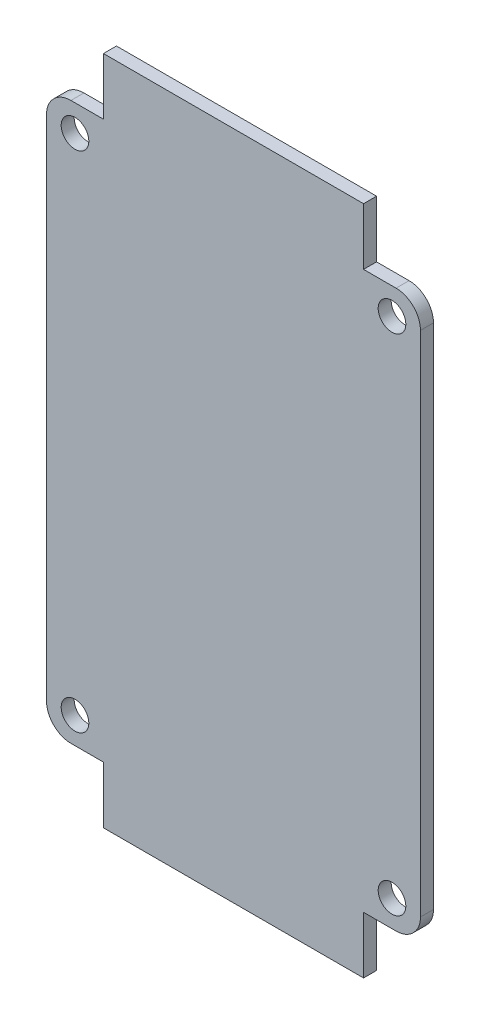
ISO-10303-21;
HEADER;
FILE_DESCRIPTION(('STEP AP214'),'2;1');
FILE_NAME('part.step','',(''),(''),'','','');
FILE_SCHEMA(('AUTOMOTIVE_DESIGN { 1 0 10303 214 1 1 1 1 }'));
ENDSEC;
DATA;
#1=APPLICATION_CONTEXT('core data for automotive mechanical design processes');
#2=APPLICATION_PROTOCOL_DEFINITION('international standard','automotive_design',2000,#1);
#3=PRODUCT_CONTEXT('',#1,'mechanical');
#4=PRODUCT('Part','Part','',(#3));
#5=PRODUCT_RELATED_PRODUCT_CATEGORY('part','',(#4));
#6=PRODUCT_DEFINITION_FORMATION('','',#4);
#7=PRODUCT_DEFINITION_CONTEXT('part definition',#1,'design');
#8=PRODUCT_DEFINITION('design','',#6,#7);
#9=PRODUCT_DEFINITION_SHAPE('','',#8);
#10=(LENGTH_UNIT() NAMED_UNIT(*) SI_UNIT(.MILLI.,.METRE.));
#11=(NAMED_UNIT(*) PLANE_ANGLE_UNIT() SI_UNIT($,.RADIAN.));
#12=(NAMED_UNIT(*) SI_UNIT($,.STERADIAN.) SOLID_ANGLE_UNIT());
#13=UNCERTAINTY_MEASURE_WITH_UNIT(LENGTH_MEASURE(1.E-05),#10,'distance_accuracy_value','');
#14=(GEOMETRIC_REPRESENTATION_CONTEXT(3) GLOBAL_UNCERTAINTY_ASSIGNED_CONTEXT((#13)) GLOBAL_UNIT_ASSIGNED_CONTEXT((#10,
#11,#12)) REPRESENTATION_CONTEXT('',''));
#15=CARTESIAN_POINT('',(0.,0.,0.));
#16=DIRECTION('',(0.,0.,1.));
#17=DIRECTION('',(1.,0.,0.));
#18=AXIS2_PLACEMENT_3D('',#15,#16,#17);
#19=CARTESIAN_POINT('',(-20.,34.25,1.6));
#20=DIRECTION('',(0.,-1.,0.));
#21=DIRECTION('',(1.,0.,0.));
#22=AXIS2_PLACEMENT_3D('',#19,#20,#21);
#23=PLANE('',#22);
#24=DIRECTION('',(-1.,0.,0.));
#25=VECTOR('',#24,1.);
#26=CARTESIAN_POINT('',(-20.,34.25,0.));
#27=LINE('',#26,#25);
#28=CARTESIAN_POINT('',(-16.,34.25,0.));
#29=VERTEX_POINT('',#28);
#30=CARTESIAN_POINT('',(-20.,34.25,0.));
#31=VERTEX_POINT('',#30);
#32=EDGE_CURVE('E180',#29,#31,#27,.T.);
#33=ORIENTED_EDGE('',*,*,#32,.T.);
#34=DIRECTION('',(0.,0.,-1.));
#35=VECTOR('',#34,1.);
#36=CARTESIAN_POINT('',(-20.,34.25,1.6));
#37=LINE('',#36,#35);
#38=CARTESIAN_POINT('',(-20.,34.25,1.6));
#39=VERTEX_POINT('',#38);
#40=EDGE_CURVE('E11',#39,#31,#37,.T.);
#41=ORIENTED_EDGE('',*,*,#40,.F.);
#42=DIRECTION('',(-1.,0.,0.));
#43=VECTOR('',#42,1.);
#44=CARTESIAN_POINT('',(-20.,34.25,1.6));
#45=LINE('',#44,#43);
#46=CARTESIAN_POINT('',(-16.,34.25,1.6));
#47=VERTEX_POINT('',#46);
#48=EDGE_CURVE('E211',#47,#39,#45,.T.);
#49=ORIENTED_EDGE('',*,*,#48,.F.);
#50=DIRECTION('',(0.,0.,-1.));
#51=VECTOR('',#50,1.);
#52=CARTESIAN_POINT('',(-16.,34.25,1.6));
#53=LINE('',#52,#51);
#54=EDGE_CURVE('E176',#47,#29,#53,.T.);
#55=ORIENTED_EDGE('',*,*,#54,.T.);
#56=EDGE_LOOP('',(#33,#41,#49,#55));
#57=FACE_BOUND('',#56,.T.);
#58=ADVANCED_FACE('F34',(#57),#23,.F.);
#59=CARTESIAN_POINT('',(-20.,31.25,1.6));
#60=DIRECTION('',(0.,0.,-1.));
#61=DIRECTION('',(-1.,0.,0.));
#62=AXIS2_PLACEMENT_3D('',#59,#60,#61);
#63=CYLINDRICAL_SURFACE('',#62,3.);
#64=CARTESIAN_POINT('',(-20.,31.25,0.));
#65=DIRECTION('',(0.,0.,1.));
#66=DIRECTION('',(-1.,0.,0.));
#67=AXIS2_PLACEMENT_3D('',#64,#65,#66);
#68=CIRCLE('',#67,3.);
#69=CARTESIAN_POINT('',(-23.,31.25,0.));
#70=VERTEX_POINT('',#69);
#71=EDGE_CURVE('E183',#31,#70,#68,.T.);
#72=ORIENTED_EDGE('',*,*,#71,.T.);
#73=DIRECTION('',(0.,0.,-1.));
#74=VECTOR('',#73,1.);
#75=CARTESIAN_POINT('',(-23.,31.25,1.6));
#76=LINE('',#75,#74);
#77=CARTESIAN_POINT('',(-23.,31.25,1.6));
#78=VERTEX_POINT('',#77);
#79=EDGE_CURVE('E43',#78,#70,#76,.T.);
#80=ORIENTED_EDGE('',*,*,#79,.F.);
#81=CARTESIAN_POINT('',(-20.,31.25,1.6));
#82=DIRECTION('',(0.,0.,1.));
#83=DIRECTION('',(-1.,0.,0.));
#84=AXIS2_PLACEMENT_3D('',#81,#82,#83);
#85=CIRCLE('',#84,3.);
#86=EDGE_CURVE('E119',#39,#78,#85,.T.);
#87=ORIENTED_EDGE('',*,*,#86,.F.);
#88=ORIENTED_EDGE('',*,*,#40,.T.);
#89=EDGE_LOOP('',(#72,#80,#87,#88));
#90=FACE_BOUND('',#89,.T.);
#91=ADVANCED_FACE('F320',(#90),#63,.T.);
#92=CARTESIAN_POINT('',(-23.,-31.25,1.6));
#93=DIRECTION('',(1.,0.,0.));
#94=DIRECTION('',(0.,0.,-1.));
#95=AXIS2_PLACEMENT_3D('',#92,#93,#94);
#96=PLANE('',#95);
#97=DIRECTION('',(0.,-1.,0.));
#98=VECTOR('',#97,1.);
#99=CARTESIAN_POINT('',(-23.,-31.25,0.));
#100=LINE('',#99,#98);
#101=CARTESIAN_POINT('',(-23.,-31.25,0.));
#102=VERTEX_POINT('',#101);
#103=EDGE_CURVE('E186',#70,#102,#100,.T.);
#104=ORIENTED_EDGE('',*,*,#103,.T.);
#105=DIRECTION('',(0.,0.,-1.));
#106=VECTOR('',#105,1.);
#107=CARTESIAN_POINT('',(-23.,-31.25,1.6));
#108=LINE('',#107,#106);
#109=CARTESIAN_POINT('',(-23.,-31.25,1.6));
#110=VERTEX_POINT('',#109);
#111=EDGE_CURVE('E242',#110,#102,#108,.T.);
#112=ORIENTED_EDGE('',*,*,#111,.F.);
#113=DIRECTION('',(0.,-1.,0.));
#114=VECTOR('',#113,1.);
#115=CARTESIAN_POINT('',(-23.,-31.25,1.6));
#116=LINE('',#115,#114);
#117=EDGE_CURVE('E272',#78,#110,#116,.T.);
#118=ORIENTED_EDGE('',*,*,#117,.F.);
#119=ORIENTED_EDGE('',*,*,#79,.T.);
#120=EDGE_LOOP('',(#104,#112,#118,#119));
#121=FACE_BOUND('',#120,.T.);
#122=ADVANCED_FACE('F324',(#121),#96,.F.);
#123=CARTESIAN_POINT('',(-20.,-31.25,1.6));
#124=DIRECTION('',(0.,0.,-1.));
#125=DIRECTION('',(-1.,0.,0.));
#126=AXIS2_PLACEMENT_3D('',#123,#124,#125);
#127=CYLINDRICAL_SURFACE('',#126,3.);
#128=CARTESIAN_POINT('',(-20.,-31.25,0.));
#129=DIRECTION('',(0.,0.,1.));
#130=DIRECTION('',(-1.,0.,0.));
#131=AXIS2_PLACEMENT_3D('',#128,#129,#130);
#132=CIRCLE('',#131,3.);
#133=CARTESIAN_POINT('',(-20.,-34.25,0.));
#134=VERTEX_POINT('',#133);
#135=EDGE_CURVE('E188',#102,#134,#132,.T.);
#136=ORIENTED_EDGE('',*,*,#135,.T.);
#137=DIRECTION('',(0.,0.,-1.));
#138=VECTOR('',#137,1.);
#139=CARTESIAN_POINT('',(-20.,-34.25,1.6));
#140=LINE('',#139,#138);
#141=CARTESIAN_POINT('',(-20.,-34.25,1.6));
#142=VERTEX_POINT('',#141);
#143=EDGE_CURVE('E239',#142,#134,#140,.T.);
#144=ORIENTED_EDGE('',*,*,#143,.F.);
#145=CARTESIAN_POINT('',(-20.,-31.25,1.6));
#146=DIRECTION('',(0.,0.,1.));
#147=DIRECTION('',(-1.,0.,0.));
#148=AXIS2_PLACEMENT_3D('',#145,#146,#147);
#149=CIRCLE('',#148,3.);
#150=EDGE_CURVE('E274',#110,#142,#149,.T.);
#151=ORIENTED_EDGE('',*,*,#150,.F.);
#152=ORIENTED_EDGE('',*,*,#111,.T.);
#153=EDGE_LOOP('',(#136,#144,#151,#152));
#154=FACE_BOUND('',#153,.T.);
#155=ADVANCED_FACE('F328',(#154),#127,.T.);
#156=CARTESIAN_POINT('',(-20.,-34.25,1.6));
#157=DIRECTION('',(0.,1.,0.));
#158=DIRECTION('',(0.,0.,1.));
#159=AXIS2_PLACEMENT_3D('',#156,#157,#158);
#160=PLANE('',#159);
#161=DIRECTION('',(1.,0.,0.));
#162=VECTOR('',#161,1.);
#163=CARTESIAN_POINT('',(-20.,-34.25,0.));
#164=LINE('',#163,#162);
#165=CARTESIAN_POINT('',(-16.,-34.25,0.));
#166=VERTEX_POINT('',#165);
#167=EDGE_CURVE('E190',#134,#166,#164,.T.);
#168=ORIENTED_EDGE('',*,*,#167,.T.);
#169=DIRECTION('',(0.,0.,-1.));
#170=VECTOR('',#169,1.);
#171=CARTESIAN_POINT('',(-16.,-34.25,1.6));
#172=LINE('',#171,#170);
#173=CARTESIAN_POINT('',(-16.,-34.25,1.6));
#174=VERTEX_POINT('',#173);
#175=EDGE_CURVE('E236',#174,#166,#172,.T.);
#176=ORIENTED_EDGE('',*,*,#175,.F.);
#177=DIRECTION('',(1.,0.,0.));
#178=VECTOR('',#177,1.);
#179=CARTESIAN_POINT('',(-20.,-34.25,1.6));
#180=LINE('',#179,#178);
#181=EDGE_CURVE('E276',#142,#174,#180,.T.);
#182=ORIENTED_EDGE('',*,*,#181,.F.);
#183=ORIENTED_EDGE('',*,*,#143,.T.);
#184=EDGE_LOOP('',(#168,#176,#182,#183));
#185=FACE_BOUND('',#184,.T.);
#186=ADVANCED_FACE('F334',(#185),#160,.F.);
#187=CARTESIAN_POINT('',(-16.,-34.25,1.6));
#188=DIRECTION('',(1.,0.,0.));
#189=DIRECTION('',(0.,0.,-1.));
#190=AXIS2_PLACEMENT_3D('',#187,#188,#189);
#191=PLANE('',#190);
#192=DIRECTION('',(0.,-1.,0.));
#193=VECTOR('',#192,1.);
#194=CARTESIAN_POINT('',(-16.,-34.25,0.));
#195=LINE('',#194,#193);
#196=CARTESIAN_POINT('',(-16.,-41.25,0.));
#197=VERTEX_POINT('',#196);
#198=EDGE_CURVE('E192',#166,#197,#195,.T.);
#199=ORIENTED_EDGE('',*,*,#198,.T.);
#200=DIRECTION('',(0.,0.,-1.));
#201=VECTOR('',#200,1.);
#202=CARTESIAN_POINT('',(-16.,-41.25,1.6));
#203=LINE('',#202,#201);
#204=CARTESIAN_POINT('',(-16.,-41.25,1.6));
#205=VERTEX_POINT('',#204);
#206=EDGE_CURVE('E233',#205,#197,#203,.T.);
#207=ORIENTED_EDGE('',*,*,#206,.F.);
#208=DIRECTION('',(0.,-1.,0.));
#209=VECTOR('',#208,1.);
#210=CARTESIAN_POINT('',(-16.,-34.25,1.6));
#211=LINE('',#210,#209);
#212=EDGE_CURVE('E278',#174,#205,#211,.T.);
#213=ORIENTED_EDGE('',*,*,#212,.F.);
#214=ORIENTED_EDGE('',*,*,#175,.T.);
#215=EDGE_LOOP('',(#199,#207,#213,#214));
#216=FACE_BOUND('',#215,.T.);
#217=ADVANCED_FACE('F338',(#216),#191,.F.);
#218=CARTESIAN_POINT('',(-16.,-41.25,1.6));
#219=DIRECTION('',(0.,1.,0.));
#220=DIRECTION('',(0.,0.,1.));
#221=AXIS2_PLACEMENT_3D('',#218,#219,#220);
#222=PLANE('',#221);
#223=DIRECTION('',(1.,0.,0.));
#224=VECTOR('',#223,1.);
#225=CARTESIAN_POINT('',(-16.,-41.25,0.));
#226=LINE('',#225,#224);
#227=CARTESIAN_POINT('',(16.,-41.25,0.));
#228=VERTEX_POINT('',#227);
#229=EDGE_CURVE('E194',#197,#228,#226,.T.);
#230=ORIENTED_EDGE('',*,*,#229,.T.);
#231=DIRECTION('',(0.,0.,-1.));
#232=VECTOR('',#231,1.);
#233=CARTESIAN_POINT('',(16.,-41.25,1.6));
#234=LINE('',#233,#232);
#235=CARTESIAN_POINT('',(16.,-41.25,1.6));
#236=VERTEX_POINT('',#235);
#237=EDGE_CURVE('E230',#236,#228,#234,.T.);
#238=ORIENTED_EDGE('',*,*,#237,.F.);
#239=DIRECTION('',(1.,0.,0.));
#240=VECTOR('',#239,1.);
#241=CARTESIAN_POINT('',(-16.,-41.25,1.6));
#242=LINE('',#241,#240);
#243=EDGE_CURVE('E280',#205,#236,#242,.T.);
#244=ORIENTED_EDGE('',*,*,#243,.F.);
#245=ORIENTED_EDGE('',*,*,#206,.T.);
#246=EDGE_LOOP('',(#230,#238,#244,#245));
#247=FACE_BOUND('',#246,.T.);
#248=ADVANCED_FACE('F342',(#247),#222,.F.);
#249=CARTESIAN_POINT('',(16.,-41.25,1.6));
#250=DIRECTION('',(-1.,0.,0.));
#251=DIRECTION('',(0.,0.,1.));
#252=AXIS2_PLACEMENT_3D('',#249,#250,#251);
#253=PLANE('',#252);
#254=DIRECTION('',(0.,1.,0.));
#255=VECTOR('',#254,1.);
#256=CARTESIAN_POINT('',(16.,-41.25,0.));
#257=LINE('',#256,#255);
#258=CARTESIAN_POINT('',(16.,-34.25,0.));
#259=VERTEX_POINT('',#258);
#260=EDGE_CURVE('E196',#228,#259,#257,.T.);
#261=ORIENTED_EDGE('',*,*,#260,.T.);
#262=DIRECTION('',(0.,0.,-1.));
#263=VECTOR('',#262,1.);
#264=CARTESIAN_POINT('',(16.,-34.25,1.6));
#265=LINE('',#264,#263);
#266=CARTESIAN_POINT('',(16.,-34.25,1.6));
#267=VERTEX_POINT('',#266);
#268=EDGE_CURVE('E227',#267,#259,#265,.T.);
#269=ORIENTED_EDGE('',*,*,#268,.F.);
#270=DIRECTION('',(0.,1.,0.));
#271=VECTOR('',#270,1.);
#272=CARTESIAN_POINT('',(16.,-41.25,1.6));
#273=LINE('',#272,#271);
#274=EDGE_CURVE('E282',#236,#267,#273,.T.);
#275=ORIENTED_EDGE('',*,*,#274,.F.);
#276=ORIENTED_EDGE('',*,*,#237,.T.);
#277=EDGE_LOOP('',(#261,#269,#275,#276));
#278=FACE_BOUND('',#277,.T.);
#279=ADVANCED_FACE('F346',(#278),#253,.F.);
#280=CARTESIAN_POINT('',(16.,-34.25,1.6));
#281=DIRECTION('',(0.,1.,0.));
#282=DIRECTION('',(0.,0.,1.));
#283=AXIS2_PLACEMENT_3D('',#280,#281,#282);
#284=PLANE('',#283);
#285=DIRECTION('',(1.,0.,0.));
#286=VECTOR('',#285,1.);
#287=CARTESIAN_POINT('',(16.,-34.25,0.));
#288=LINE('',#287,#286);
#289=CARTESIAN_POINT('',(20.,-34.25,0.));
#290=VERTEX_POINT('',#289);
#291=EDGE_CURVE('E198',#259,#290,#288,.T.);
#292=ORIENTED_EDGE('',*,*,#291,.T.);
#293=DIRECTION('',(0.,0.,-1.));
#294=VECTOR('',#293,1.);
#295=CARTESIAN_POINT('',(20.,-34.25,1.6));
#296=LINE('',#295,#294);
#297=CARTESIAN_POINT('',(20.,-34.25,1.6));
#298=VERTEX_POINT('',#297);
#299=EDGE_CURVE('E224',#298,#290,#296,.T.);
#300=ORIENTED_EDGE('',*,*,#299,.F.);
#301=DIRECTION('',(1.,0.,0.));
#302=VECTOR('',#301,1.);
#303=CARTESIAN_POINT('',(16.,-34.25,1.6));
#304=LINE('',#303,#302);
#305=EDGE_CURVE('E284',#267,#298,#304,.T.);
#306=ORIENTED_EDGE('',*,*,#305,.F.);
#307=ORIENTED_EDGE('',*,*,#268,.T.);
#308=EDGE_LOOP('',(#292,#300,#306,#307));
#309=FACE_BOUND('',#308,.T.);
#310=ADVANCED_FACE('F350',(#309),#284,.F.);
#311=CARTESIAN_POINT('',(20.,-31.25,1.6));
#312=DIRECTION('',(0.,0.,-1.));
#313=DIRECTION('',(-1.,0.,0.));
#314=AXIS2_PLACEMENT_3D('',#311,#312,#313);
#315=CYLINDRICAL_SURFACE('',#314,3.);
#316=CARTESIAN_POINT('',(20.,-31.25,0.));
#317=DIRECTION('',(0.,0.,1.));
#318=DIRECTION('',(1.,0.,0.));
#319=AXIS2_PLACEMENT_3D('',#316,#317,#318);
#320=CIRCLE('',#319,3.);
#321=CARTESIAN_POINT('',(23.,-31.25,0.));
#322=VERTEX_POINT('',#321);
#323=EDGE_CURVE('E200',#290,#322,#320,.T.);
#324=ORIENTED_EDGE('',*,*,#323,.T.);
#325=DIRECTION('',(0.,0.,-1.));
#326=VECTOR('',#325,1.);
#327=CARTESIAN_POINT('',(23.,-31.25,1.6));
#328=LINE('',#327,#326);
#329=CARTESIAN_POINT('',(23.,-31.25,1.6));
#330=VERTEX_POINT('',#329);
#331=EDGE_CURVE('E221',#330,#322,#328,.T.);
#332=ORIENTED_EDGE('',*,*,#331,.F.);
#333=CARTESIAN_POINT('',(20.,-31.25,1.6));
#334=DIRECTION('',(0.,0.,1.));
#335=DIRECTION('',(1.,0.,0.));
#336=AXIS2_PLACEMENT_3D('',#333,#334,#335);
#337=CIRCLE('',#336,3.);
#338=EDGE_CURVE('E286',#298,#330,#337,.T.);
#339=ORIENTED_EDGE('',*,*,#338,.F.);
#340=ORIENTED_EDGE('',*,*,#299,.T.);
#341=EDGE_LOOP('',(#324,#332,#339,#340));
#342=FACE_BOUND('',#341,.T.);
#343=ADVANCED_FACE('F354',(#342),#315,.T.);
#344=CARTESIAN_POINT('',(23.,-31.25,1.6));
#345=DIRECTION('',(-1.,0.,0.));
#346=DIRECTION('',(0.,0.,1.));
#347=AXIS2_PLACEMENT_3D('',#344,#345,#346);
#348=PLANE('',#347);
#349=DIRECTION('',(0.,1.,0.));
#350=VECTOR('',#349,1.);
#351=CARTESIAN_POINT('',(23.,-31.25,0.));
#352=LINE('',#351,#350);
#353=CARTESIAN_POINT('',(23.,31.25,0.));
#354=VERTEX_POINT('',#353);
#355=EDGE_CURVE('E202',#322,#354,#352,.T.);
#356=ORIENTED_EDGE('',*,*,#355,.T.);
#357=DIRECTION('',(0.,0.,-1.));
#358=VECTOR('',#357,1.);
#359=CARTESIAN_POINT('',(23.,31.25,1.6));
#360=LINE('',#359,#358);
#361=CARTESIAN_POINT('',(23.,31.25,1.6));
#362=VERTEX_POINT('',#361);
#363=EDGE_CURVE('E218',#362,#354,#360,.T.);
#364=ORIENTED_EDGE('',*,*,#363,.F.);
#365=DIRECTION('',(0.,1.,0.));
#366=VECTOR('',#365,1.);
#367=CARTESIAN_POINT('',(23.,-31.25,1.6));
#368=LINE('',#367,#366);
#369=EDGE_CURVE('E288',#330,#362,#368,.T.);
#370=ORIENTED_EDGE('',*,*,#369,.F.);
#371=ORIENTED_EDGE('',*,*,#331,.T.);
#372=EDGE_LOOP('',(#356,#364,#370,#371));
#373=FACE_BOUND('',#372,.T.);
#374=ADVANCED_FACE('F358',(#373),#348,.F.);
#375=CARTESIAN_POINT('',(20.,31.25,1.6));
#376=DIRECTION('',(0.,0.,-1.));
#377=DIRECTION('',(-1.,0.,0.));
#378=AXIS2_PLACEMENT_3D('',#375,#376,#377);
#379=CYLINDRICAL_SURFACE('',#378,3.00000000000001);
#380=CARTESIAN_POINT('',(20.,31.25,0.));
#381=DIRECTION('',(0.,0.,1.));
#382=DIRECTION('',(-1.,0.,0.));
#383=AXIS2_PLACEMENT_3D('',#380,#381,#382);
#384=CIRCLE('',#383,3.00000000000001);
#385=CARTESIAN_POINT('',(20.,34.25,0.));
#386=VERTEX_POINT('',#385);
#387=EDGE_CURVE('E204',#354,#386,#384,.T.);
#388=ORIENTED_EDGE('',*,*,#387,.T.);
#389=DIRECTION('',(0.,0.,-1.));
#390=VECTOR('',#389,1.);
#391=CARTESIAN_POINT('',(20.,34.25,1.6));
#392=LINE('',#391,#390);
#393=CARTESIAN_POINT('',(20.,34.25,1.6));
#394=VERTEX_POINT('',#393);
#395=EDGE_CURVE('E215',#394,#386,#392,.T.);
#396=ORIENTED_EDGE('',*,*,#395,.F.);
#397=CARTESIAN_POINT('',(20.,31.25,1.6));
#398=DIRECTION('',(0.,0.,1.));
#399=DIRECTION('',(-1.,0.,0.));
#400=AXIS2_PLACEMENT_3D('',#397,#398,#399);
#401=CIRCLE('',#400,3.00000000000001);
#402=EDGE_CURVE('E290',#362,#394,#401,.T.);
#403=ORIENTED_EDGE('',*,*,#402,.F.);
#404=ORIENTED_EDGE('',*,*,#363,.T.);
#405=EDGE_LOOP('',(#388,#396,#403,#404));
#406=FACE_BOUND('',#405,.T.);
#407=ADVANCED_FACE('F296',(#406),#379,.T.);
#408=CARTESIAN_POINT('',(16.,34.25,1.6));
#409=DIRECTION('',(0.,-1.,0.));
#410=DIRECTION('',(1.,0.,0.));
#411=AXIS2_PLACEMENT_3D('',#408,#409,#410);
#412=PLANE('',#411);
#413=DIRECTION('',(-1.,0.,0.));
#414=VECTOR('',#413,1.);
#415=CARTESIAN_POINT('',(16.,34.25,0.));
#416=LINE('',#415,#414);
#417=CARTESIAN_POINT('',(16.,34.25,0.));
#418=VERTEX_POINT('',#417);
#419=EDGE_CURVE('E206',#386,#418,#416,.T.);
#420=ORIENTED_EDGE('',*,*,#419,.T.);
#421=DIRECTION('',(0.,0.,-1.));
#422=VECTOR('',#421,1.);
#423=CARTESIAN_POINT('',(16.,34.25,1.6));
#424=LINE('',#423,#422);
#425=CARTESIAN_POINT('',(16.,34.25,1.6));
#426=VERTEX_POINT('',#425);
#427=EDGE_CURVE('E171',#426,#418,#424,.T.);
#428=ORIENTED_EDGE('',*,*,#427,.F.);
#429=DIRECTION('',(-1.,0.,0.));
#430=VECTOR('',#429,1.);
#431=CARTESIAN_POINT('',(16.,34.25,1.6));
#432=LINE('',#431,#430);
#433=EDGE_CURVE('E162',#394,#426,#432,.T.);
#434=ORIENTED_EDGE('',*,*,#433,.F.);
#435=ORIENTED_EDGE('',*,*,#395,.T.);
#436=EDGE_LOOP('',(#420,#428,#434,#435));
#437=FACE_BOUND('',#436,.T.);
#438=ADVANCED_FACE('F300',(#437),#412,.F.);
#439=CARTESIAN_POINT('',(16.,41.25,1.6));
#440=DIRECTION('',(-1.,0.,0.));
#441=DIRECTION('',(0.,-1.,0.));
#442=AXIS2_PLACEMENT_3D('',#439,#440,#441);
#443=PLANE('',#442);
#444=DIRECTION('',(0.,1.,0.));
#445=VECTOR('',#444,1.);
#446=CARTESIAN_POINT('',(16.,41.25,0.));
#447=LINE('',#446,#445);
#448=CARTESIAN_POINT('',(16.,41.25,0.));
#449=VERTEX_POINT('',#448);
#450=EDGE_CURVE('E170',#418,#449,#447,.T.);
#451=ORIENTED_EDGE('',*,*,#450,.T.);
#452=DIRECTION('',(0.,0.,-1.));
#453=VECTOR('',#452,1.);
#454=CARTESIAN_POINT('',(16.,41.25,1.6));
#455=LINE('',#454,#453);
#456=CARTESIAN_POINT('',(16.,41.25,1.6));
#457=VERTEX_POINT('',#456);
#458=EDGE_CURVE('E167',#457,#449,#455,.T.);
#459=ORIENTED_EDGE('',*,*,#458,.F.);
#460=DIRECTION('',(0.,1.,0.));
#461=VECTOR('',#460,1.);
#462=CARTESIAN_POINT('',(16.,41.25,1.6));
#463=LINE('',#462,#461);
#464=EDGE_CURVE('E156',#426,#457,#463,.T.);
#465=ORIENTED_EDGE('',*,*,#464,.F.);
#466=ORIENTED_EDGE('',*,*,#427,.T.);
#467=EDGE_LOOP('',(#451,#459,#465,#466));
#468=FACE_BOUND('',#467,.T.);
#469=ADVANCED_FACE('F168',(#468),#443,.F.);
#470=CARTESIAN_POINT('',(-16.,41.25,1.6));
#471=DIRECTION('',(0.,-1.,0.));
#472=DIRECTION('',(0.,0.,-1.));
#473=AXIS2_PLACEMENT_3D('',#470,#471,#472);
#474=PLANE('',#473);
#475=DIRECTION('',(-1.,0.,0.));
#476=VECTOR('',#475,1.);
#477=CARTESIAN_POINT('',(-16.,41.25,0.));
#478=LINE('',#477,#476);
#479=CARTESIAN_POINT('',(-16.,41.25,0.));
#480=VERTEX_POINT('',#479);
#481=EDGE_CURVE('E105',#449,#480,#478,.T.);
#482=ORIENTED_EDGE('',*,*,#481,.T.);
#483=DIRECTION('',(0.,0.,-1.));
#484=VECTOR('',#483,1.);
#485=CARTESIAN_POINT('',(-16.,41.25,1.6));
#486=LINE('',#485,#484);
#487=CARTESIAN_POINT('',(-16.,41.25,1.6));
#488=VERTEX_POINT('',#487);
#489=EDGE_CURVE('E172',#488,#480,#486,.T.);
#490=ORIENTED_EDGE('',*,*,#489,.F.);
#491=DIRECTION('',(-1.,0.,0.));
#492=VECTOR('',#491,1.);
#493=CARTESIAN_POINT('',(-16.,41.25,1.6));
#494=LINE('',#493,#492);
#495=EDGE_CURVE('E160',#457,#488,#494,.T.);
#496=ORIENTED_EDGE('',*,*,#495,.F.);
#497=ORIENTED_EDGE('',*,*,#458,.T.);
#498=EDGE_LOOP('',(#482,#490,#496,#497));
#499=FACE_BOUND('',#498,.T.);
#500=ADVANCED_FACE('F174',(#499),#474,.F.);
#501=CARTESIAN_POINT('',(-16.,34.25,1.6));
#502=DIRECTION('',(1.,0.,0.));
#503=DIRECTION('',(0.,1.,0.));
#504=AXIS2_PLACEMENT_3D('',#501,#502,#503);
#505=PLANE('',#504);
#506=DIRECTION('',(0.,-1.,0.));
#507=VECTOR('',#506,1.);
#508=CARTESIAN_POINT('',(-16.,34.25,0.));
#509=LINE('',#508,#507);
#510=EDGE_CURVE('E111',#480,#29,#509,.T.);
#511=ORIENTED_EDGE('',*,*,#510,.T.);
#512=ORIENTED_EDGE('',*,*,#54,.F.);
#513=DIRECTION('',(0.,-1.,0.));
#514=VECTOR('',#513,1.);
#515=CARTESIAN_POINT('',(-16.,34.25,1.6));
#516=LINE('',#515,#514);
#517=EDGE_CURVE('E52',#488,#47,#516,.T.);
#518=ORIENTED_EDGE('',*,*,#517,.F.);
#519=ORIENTED_EDGE('',*,*,#489,.T.);
#520=EDGE_LOOP('',(#511,#512,#518,#519));
#521=FACE_BOUND('',#520,.T.);
#522=ADVANCED_FACE('F308',(#521),#505,.F.);
#523=CARTESIAN_POINT('',(20.,31.25,1.6));
#524=DIRECTION('',(0.,0.,-1.));
#525=DIRECTION('',(-1.,0.,0.));
#526=AXIS2_PLACEMENT_3D('',#523,#524,#525);
#527=PLANE('',#526);
#528=CARTESIAN_POINT('',(-19.5,31.,1.6));
#529=DIRECTION('',(0.,0.,1.));
#530=DIRECTION('',(1.,0.,0.));
#531=AXIS2_PLACEMENT_3D('',#528,#529,#530);
#532=CIRCLE('',#531,1.7);
#533=CARTESIAN_POINT('',(-17.8,31.,1.6));
#534=VERTEX_POINT('',#533);
#535=EDGE_CURVE('E263',#534,#534,#532,.T.);
#536=ORIENTED_EDGE('',*,*,#535,.F.);
#537=EDGE_LOOP('',(#536));
#538=FACE_BOUND('',#537,.T.);
#539=CARTESIAN_POINT('',(19.5,31.,1.6));
#540=DIRECTION('',(0.,0.,1.));
#541=DIRECTION('',(1.,0.,0.));
#542=AXIS2_PLACEMENT_3D('',#539,#540,#541);
#543=CIRCLE('',#542,1.7);
#544=CARTESIAN_POINT('',(21.2,31.,1.6));
#545=VERTEX_POINT('',#544);
#546=EDGE_CURVE('E253',#545,#545,#543,.T.);
#547=ORIENTED_EDGE('',*,*,#546,.F.);
#548=EDGE_LOOP('',(#547));
#549=FACE_BOUND('',#548,.T.);
#550=CARTESIAN_POINT('',(19.5,-31.,1.6));
#551=DIRECTION('',(0.,0.,1.));
#552=DIRECTION('',(1.,0.,0.));
#553=AXIS2_PLACEMENT_3D('',#550,#551,#552);
#554=CIRCLE('',#553,1.7);
#555=CARTESIAN_POINT('',(21.2,-31.,1.6));
#556=VERTEX_POINT('',#555);
#557=EDGE_CURVE('E250',#556,#556,#554,.T.);
#558=ORIENTED_EDGE('',*,*,#557,.F.);
#559=EDGE_LOOP('',(#558));
#560=FACE_BOUND('',#559,.T.);
#561=CARTESIAN_POINT('',(-19.5,-31.,1.6));
#562=DIRECTION('',(0.,0.,1.));
#563=DIRECTION('',(1.,0.,0.));
#564=AXIS2_PLACEMENT_3D('',#561,#562,#563);
#565=CIRCLE('',#564,1.7);
#566=CARTESIAN_POINT('',(-17.8,-31.,1.6));
#567=VERTEX_POINT('',#566);
#568=EDGE_CURVE('E249',#567,#567,#565,.T.);
#569=ORIENTED_EDGE('',*,*,#568,.F.);
#570=EDGE_LOOP('',(#569));
#571=FACE_BOUND('',#570,.T.);
#572=ORIENTED_EDGE('',*,*,#48,.T.);
#573=ORIENTED_EDGE('',*,*,#86,.T.);
#574=ORIENTED_EDGE('',*,*,#117,.T.);
#575=ORIENTED_EDGE('',*,*,#150,.T.);
#576=ORIENTED_EDGE('',*,*,#181,.T.);
#577=ORIENTED_EDGE('',*,*,#212,.T.);
#578=ORIENTED_EDGE('',*,*,#243,.T.);
#579=ORIENTED_EDGE('',*,*,#274,.T.);
#580=ORIENTED_EDGE('',*,*,#305,.T.);
#581=ORIENTED_EDGE('',*,*,#338,.T.);
#582=ORIENTED_EDGE('',*,*,#369,.T.);
#583=ORIENTED_EDGE('',*,*,#402,.T.);
#584=ORIENTED_EDGE('',*,*,#433,.T.);
#585=ORIENTED_EDGE('',*,*,#464,.T.);
#586=ORIENTED_EDGE('',*,*,#495,.T.);
#587=ORIENTED_EDGE('',*,*,#517,.T.);
#588=EDGE_LOOP('',(#572,#573,#574,#575,#576,#577,#578,#579,#580,#581,#582,#583,#584,#585,#586,#587));
#589=FACE_BOUND('',#588,.T.);
#590=ADVANCED_FACE('F158',(#538,#549,#560,#571,#589),#527,.F.);
#591=CARTESIAN_POINT('',(20.,31.25,0.));
#592=DIRECTION('',(0.,0.,-1.));
#593=DIRECTION('',(-1.,0.,0.));
#594=AXIS2_PLACEMENT_3D('',#591,#592,#593);
#595=PLANE('',#594);
#596=CARTESIAN_POINT('',(-19.5,31.,0.));
#597=DIRECTION('',(0.,0.,-1.));
#598=DIRECTION('',(-1.,0.,0.));
#599=AXIS2_PLACEMENT_3D('',#596,#597,#598);
#600=CIRCLE('',#599,1.7);
#601=CARTESIAN_POINT('',(-21.2,31.,0.));
#602=VERTEX_POINT('',#601);
#603=EDGE_CURVE('E37',#602,#602,#600,.T.);
#604=ORIENTED_EDGE('',*,*,#603,.F.);
#605=EDGE_LOOP('',(#604));
#606=FACE_BOUND('',#605,.T.);
#607=CARTESIAN_POINT('',(19.5,31.,0.));
#608=DIRECTION('',(0.,0.,-1.));
#609=DIRECTION('',(-1.,0.,0.));
#610=AXIS2_PLACEMENT_3D('',#607,#608,#609);
#611=CIRCLE('',#610,1.7);
#612=CARTESIAN_POINT('',(17.8,31.,0.));
#613=VERTEX_POINT('',#612);
#614=EDGE_CURVE('E251',#613,#613,#611,.T.);
#615=ORIENTED_EDGE('',*,*,#614,.F.);
#616=EDGE_LOOP('',(#615));
#617=FACE_BOUND('',#616,.T.);
#618=CARTESIAN_POINT('',(19.5,-31.,0.));
#619=DIRECTION('',(0.,0.,-1.));
#620=DIRECTION('',(-1.,0.,0.));
#621=AXIS2_PLACEMENT_3D('',#618,#619,#620);
#622=CIRCLE('',#621,1.7);
#623=CARTESIAN_POINT('',(17.8,-31.,0.));
#624=VERTEX_POINT('',#623);
#625=EDGE_CURVE('E247',#624,#624,#622,.T.);
#626=ORIENTED_EDGE('',*,*,#625,.F.);
#627=EDGE_LOOP('',(#626));
#628=FACE_BOUND('',#627,.T.);
#629=CARTESIAN_POINT('',(-19.5,-31.,0.));
#630=DIRECTION('',(0.,0.,-1.));
#631=DIRECTION('',(-1.,0.,0.));
#632=AXIS2_PLACEMENT_3D('',#629,#630,#631);
#633=CIRCLE('',#632,1.7);
#634=CARTESIAN_POINT('',(-21.2,-31.,0.));
#635=VERTEX_POINT('',#634);
#636=EDGE_CURVE('E184',#635,#635,#633,.T.);
#637=ORIENTED_EDGE('',*,*,#636,.F.);
#638=EDGE_LOOP('',(#637));
#639=FACE_BOUND('',#638,.T.);
#640=ORIENTED_EDGE('',*,*,#32,.F.);
#641=ORIENTED_EDGE('',*,*,#510,.F.);
#642=ORIENTED_EDGE('',*,*,#481,.F.);
#643=ORIENTED_EDGE('',*,*,#450,.F.);
#644=ORIENTED_EDGE('',*,*,#419,.F.);
#645=ORIENTED_EDGE('',*,*,#387,.F.);
#646=ORIENTED_EDGE('',*,*,#355,.F.);
#647=ORIENTED_EDGE('',*,*,#323,.F.);
#648=ORIENTED_EDGE('',*,*,#291,.F.);
#649=ORIENTED_EDGE('',*,*,#260,.F.);
#650=ORIENTED_EDGE('',*,*,#229,.F.);
#651=ORIENTED_EDGE('',*,*,#198,.F.);
#652=ORIENTED_EDGE('',*,*,#167,.F.);
#653=ORIENTED_EDGE('',*,*,#135,.F.);
#654=ORIENTED_EDGE('',*,*,#103,.F.);
#655=ORIENTED_EDGE('',*,*,#71,.F.);
#656=EDGE_LOOP('',(#640,#641,#642,#643,#644,#645,#646,#647,#648,#649,#650,#651,#652,#653,#654,#655));
#657=FACE_BOUND('',#656,.T.);
#658=ADVANCED_FACE('F303',(#606,#617,#628,#639,#657),#595,.T.);
#659=CARTESIAN_POINT('',(-19.5,-31.,1.6));
#660=DIRECTION('',(0.,0.,1.));
#661=DIRECTION('',(1.,0.,0.));
#662=AXIS2_PLACEMENT_3D('',#659,#660,#661);
#663=CYLINDRICAL_SURFACE('',#662,1.7);
#664=ORIENTED_EDGE('',*,*,#636,.T.);
#665=EDGE_LOOP('',(#664));
#666=FACE_BOUND('',#665,.T.);
#667=ORIENTED_EDGE('',*,*,#568,.T.);
#668=EDGE_LOOP('',(#667));
#669=FACE_BOUND('',#668,.T.);
#670=ADVANCED_FACE('F397',(#666,#669),#663,.F.);
#671=CARTESIAN_POINT('',(19.5,-31.,1.6));
#672=DIRECTION('',(0.,0.,1.));
#673=DIRECTION('',(1.,0.,0.));
#674=AXIS2_PLACEMENT_3D('',#671,#672,#673);
#675=CYLINDRICAL_SURFACE('',#674,1.7);
#676=ORIENTED_EDGE('',*,*,#625,.T.);
#677=EDGE_LOOP('',(#676));
#678=FACE_BOUND('',#677,.T.);
#679=ORIENTED_EDGE('',*,*,#557,.T.);
#680=EDGE_LOOP('',(#679));
#681=FACE_BOUND('',#680,.T.);
#682=ADVANCED_FACE('F406',(#678,#681),#675,.F.);
#683=CARTESIAN_POINT('',(19.5,31.,1.6));
#684=DIRECTION('',(0.,0.,1.));
#685=DIRECTION('',(1.,0.,0.));
#686=AXIS2_PLACEMENT_3D('',#683,#684,#685);
#687=CYLINDRICAL_SURFACE('',#686,1.7);
#688=ORIENTED_EDGE('',*,*,#614,.T.);
#689=EDGE_LOOP('',(#688));
#690=FACE_BOUND('',#689,.T.);
#691=ORIENTED_EDGE('',*,*,#546,.T.);
#692=EDGE_LOOP('',(#691));
#693=FACE_BOUND('',#692,.T.);
#694=ADVANCED_FACE('F416',(#690,#693),#687,.F.);
#695=CARTESIAN_POINT('',(-19.5,31.,1.6));
#696=DIRECTION('',(0.,0.,1.));
#697=DIRECTION('',(1.,0.,0.));
#698=AXIS2_PLACEMENT_3D('',#695,#696,#697);
#699=CYLINDRICAL_SURFACE('',#698,1.7);
#700=ORIENTED_EDGE('',*,*,#603,.T.);
#701=EDGE_LOOP('',(#700));
#702=FACE_BOUND('',#701,.T.);
#703=ORIENTED_EDGE('',*,*,#535,.T.);
#704=EDGE_LOOP('',(#703));
#705=FACE_BOUND('',#704,.T.);
#706=ADVANCED_FACE('F426',(#702,#705),#699,.F.);
#707=CLOSED_SHELL('',(#58,#91,#122,#155,#186,#217,#248,#279,#310,#343,#374,#407,#438,#469,#500,
#522,#590,#658,#670,#682,#694,#706));
#708=MANIFOLD_SOLID_BREP('B2',#707);
#709=ADVANCED_BREP_SHAPE_REPRESENTATION('',(#18,#708),#14);
#710=SHAPE_DEFINITION_REPRESENTATION(#9,#709);
ENDSEC;
END-ISO-10303-21;
